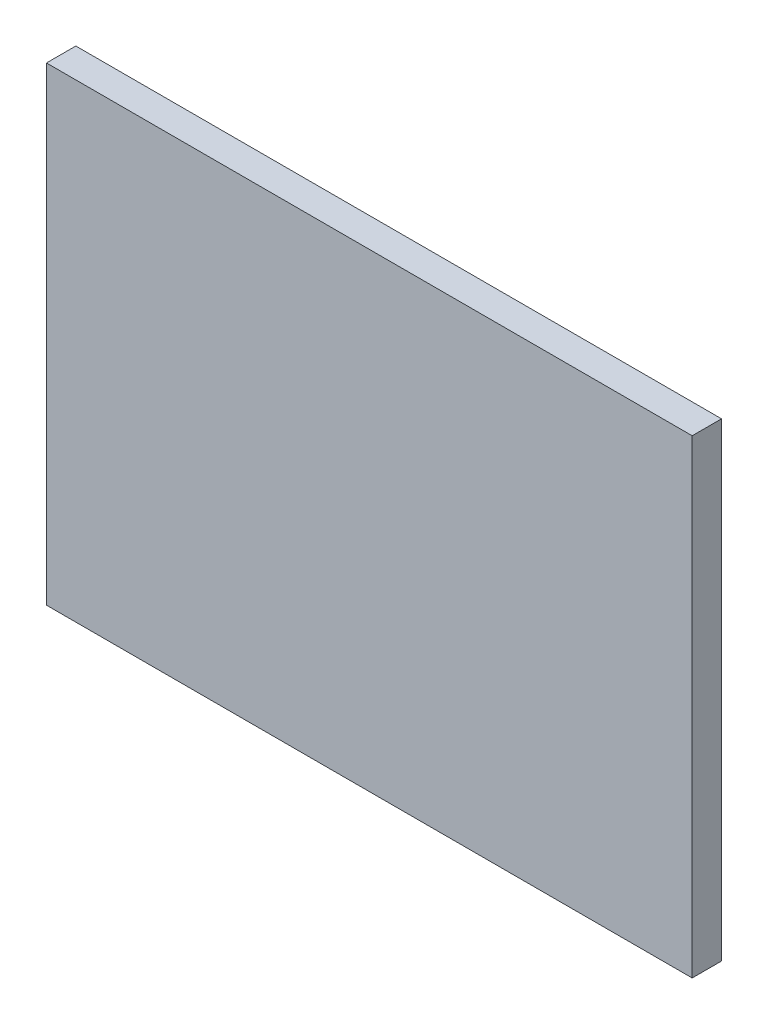
ISO-10303-21;
HEADER;
FILE_DESCRIPTION(('STEP AP214'),'2;1');
FILE_NAME('part.step','',(''),(''),'','','');
FILE_SCHEMA(('AUTOMOTIVE_DESIGN { 1 0 10303 214 1 1 1 1 }'));
ENDSEC;
DATA;
#1=APPLICATION_CONTEXT('core data for automotive mechanical design processes');
#2=APPLICATION_PROTOCOL_DEFINITION('international standard','automotive_design',2000,#1);
#3=PRODUCT_CONTEXT('',#1,'mechanical');
#4=PRODUCT('Part','Part','',(#3));
#5=PRODUCT_RELATED_PRODUCT_CATEGORY('part','',(#4));
#6=PRODUCT_DEFINITION_FORMATION('','',#4);
#7=PRODUCT_DEFINITION_CONTEXT('part definition',#1,'design');
#8=PRODUCT_DEFINITION('design','',#6,#7);
#9=PRODUCT_DEFINITION_SHAPE('','',#8);
#10=(LENGTH_UNIT() NAMED_UNIT(*) SI_UNIT(.MILLI.,.METRE.));
#11=(NAMED_UNIT(*) PLANE_ANGLE_UNIT() SI_UNIT($,.RADIAN.));
#12=(NAMED_UNIT(*) SI_UNIT($,.STERADIAN.) SOLID_ANGLE_UNIT());
#13=UNCERTAINTY_MEASURE_WITH_UNIT(LENGTH_MEASURE(1.E-05),#10,'distance_accuracy_value','');
#14=(GEOMETRIC_REPRESENTATION_CONTEXT(3) GLOBAL_UNCERTAINTY_ASSIGNED_CONTEXT((#13)) GLOBAL_UNIT_ASSIGNED_CONTEXT((#10,
#11,#12)) REPRESENTATION_CONTEXT('',''));
#15=CARTESIAN_POINT('',(0.,0.,0.));
#16=DIRECTION('',(0.,0.,1.));
#17=DIRECTION('',(1.,0.,0.));
#18=AXIS2_PLACEMENT_3D('',#15,#16,#17);
#19=CARTESIAN_POINT('',(-0.8,-0.4,0.));
#20=DIRECTION('',(0.,-1.,0.));
#21=DIRECTION('',(0.,0.,-1.));
#22=AXIS2_PLACEMENT_3D('',#19,#20,#21);
#23=PLANE('',#22);
#24=DIRECTION('',(0.,0.,-1.));
#25=VECTOR('',#24,1.);
#26=CARTESIAN_POINT('',(0.550004554478,-0.4,0.275));
#27=LINE('',#26,#25);
#28=CARTESIAN_POINT('',(0.550004554478,-0.4,0.55));
#29=VERTEX_POINT('',#28);
#30=CARTESIAN_POINT('',(0.550004554478,-0.4,0.5));
#31=VERTEX_POINT('',#30);
#32=EDGE_CURVE('E73',#29,#31,#27,.T.);
#33=ORIENTED_EDGE('',*,*,#32,.F.);
#34=DIRECTION('',(1.,0.,0.));
#35=VECTOR('',#34,1.);
#36=CARTESIAN_POINT('',(-0.8,-0.4,0.55));
#37=LINE('',#36,#35);
#38=CARTESIAN_POINT('',(-0.550004554478,-0.4,0.55));
#39=VERTEX_POINT('',#38);
#40=EDGE_CURVE('E11',#39,#29,#37,.T.);
#41=ORIENTED_EDGE('',*,*,#40,.F.);
#42=DIRECTION('',(0.,0.,1.));
#43=VECTOR('',#42,1.);
#44=CARTESIAN_POINT('',(-0.550004554478,-0.4,0.275));
#45=LINE('',#44,#43);
#46=CARTESIAN_POINT('',(-0.550004554478,-0.4,0.5));
#47=VERTEX_POINT('',#46);
#48=EDGE_CURVE('E94',#47,#39,#45,.T.);
#49=ORIENTED_EDGE('',*,*,#48,.F.);
#50=DIRECTION('',(-1.,0.,0.));
#51=VECTOR('',#50,1.);
#52=CARTESIAN_POINT('',(-0.4,-0.4,0.5));
#53=LINE('',#52,#51);
#54=EDGE_CURVE('E84',#31,#47,#53,.T.);
#55=ORIENTED_EDGE('',*,*,#54,.F.);
#56=EDGE_LOOP('',(#33,#41,#49,#55));
#57=FACE_BOUND('',#56,.T.);
#58=ADVANCED_FACE('F16',(#57),#23,.T.);
#59=CARTESIAN_POINT('',(0.,0.,0.55));
#60=DIRECTION('',(0.,0.,1.));
#61=DIRECTION('',(1.,0.,0.));
#62=AXIS2_PLACEMENT_3D('',#59,#60,#61);
#63=PLANE('',#62);
#64=DIRECTION('',(0.,-1.,0.));
#65=VECTOR('',#64,1.);
#66=CARTESIAN_POINT('',(0.550004554478,0.24884557297,0.55));
#67=LINE('',#66,#65);
#68=CARTESIAN_POINT('',(0.550004554478,0.4,0.55));
#69=VERTEX_POINT('',#68);
#70=EDGE_CURVE('E115',#69,#29,#67,.T.);
#71=ORIENTED_EDGE('',*,*,#70,.F.);
#72=DIRECTION('',(-1.,0.,0.));
#73=VECTOR('',#72,1.);
#74=CARTESIAN_POINT('',(0.8,0.4,0.55));
#75=LINE('',#74,#73);
#76=CARTESIAN_POINT('',(-0.550004554478,0.4,0.55));
#77=VERTEX_POINT('',#76);
#78=EDGE_CURVE('E26',#69,#77,#75,.T.);
#79=ORIENTED_EDGE('',*,*,#78,.T.);
#80=DIRECTION('',(0.,1.,0.));
#81=VECTOR('',#80,1.);
#82=CARTESIAN_POINT('',(-0.550004554478,-0.24884557297,0.55));
#83=LINE('',#82,#81);
#84=EDGE_CURVE('E71',#39,#77,#83,.T.);
#85=ORIENTED_EDGE('',*,*,#84,.F.);
#86=ORIENTED_EDGE('',*,*,#40,.T.);
#87=EDGE_LOOP('',(#71,#79,#85,#86));
#88=FACE_BOUND('',#87,.T.);
#89=ADVANCED_FACE('F107',(#88),#63,.T.);
#90=CARTESIAN_POINT('',(0.8,0.4,0.));
#91=DIRECTION('',(0.,1.,0.));
#92=DIRECTION('',(1.,0.,0.));
#93=AXIS2_PLACEMENT_3D('',#90,#91,#92);
#94=PLANE('',#93);
#95=DIRECTION('',(0.,0.,1.));
#96=VECTOR('',#95,1.);
#97=CARTESIAN_POINT('',(0.550004554478,0.4,0.275));
#98=LINE('',#97,#96);
#99=CARTESIAN_POINT('',(0.550004554478,0.4,0.5));
#100=VERTEX_POINT('',#99);
#101=EDGE_CURVE('E54',#100,#69,#98,.T.);
#102=ORIENTED_EDGE('',*,*,#101,.F.);
#103=DIRECTION('',(1.,0.,0.));
#104=VECTOR('',#103,1.);
#105=CARTESIAN_POINT('',(0.4,0.4,0.5));
#106=LINE('',#105,#104);
#107=CARTESIAN_POINT('',(-0.550004554478,0.4,0.5));
#108=VERTEX_POINT('',#107);
#109=EDGE_CURVE('E76',#108,#100,#106,.T.);
#110=ORIENTED_EDGE('',*,*,#109,.F.);
#111=DIRECTION('',(0.,0.,-1.));
#112=VECTOR('',#111,1.);
#113=CARTESIAN_POINT('',(-0.550004554478,0.4,0.275));
#114=LINE('',#113,#112);
#115=EDGE_CURVE('E64',#77,#108,#114,.T.);
#116=ORIENTED_EDGE('',*,*,#115,.F.);
#117=ORIENTED_EDGE('',*,*,#78,.F.);
#118=EDGE_LOOP('',(#102,#110,#116,#117));
#119=FACE_BOUND('',#118,.T.);
#120=ADVANCED_FACE('F18',(#119),#94,.T.);
#121=CARTESIAN_POINT('',(0.550004554478,0.497691145939,0.55));
#122=DIRECTION('',(1.,0.,0.));
#123=DIRECTION('',(0.,1.,0.));
#124=AXIS2_PLACEMENT_3D('',#121,#122,#123);
#125=PLANE('',#124);
#126=ORIENTED_EDGE('',*,*,#32,.T.);
#127=DIRECTION('',(0.,-1.,0.));
#128=VECTOR('',#127,1.);
#129=CARTESIAN_POINT('',(0.550004554478,-0.497691145939,0.5));
#130=LINE('',#129,#128);
#131=EDGE_CURVE('E80',#100,#31,#130,.T.);
#132=ORIENTED_EDGE('',*,*,#131,.F.);
#133=ORIENTED_EDGE('',*,*,#101,.T.);
#134=ORIENTED_EDGE('',*,*,#70,.T.);
#135=EDGE_LOOP('',(#126,#132,#133,#134));
#136=FACE_BOUND('',#135,.T.);
#137=ADVANCED_FACE('F124',(#136),#125,.T.);
#138=CARTESIAN_POINT('',(-0.550004554478,-0.497691145939,0.55));
#139=DIRECTION('',(-1.,0.,0.));
#140=DIRECTION('',(0.,0.,1.));
#141=AXIS2_PLACEMENT_3D('',#138,#139,#140);
#142=PLANE('',#141);
#143=ORIENTED_EDGE('',*,*,#48,.T.);
#144=ORIENTED_EDGE('',*,*,#84,.T.);
#145=ORIENTED_EDGE('',*,*,#115,.T.);
#146=DIRECTION('',(0.,1.,0.));
#147=VECTOR('',#146,1.);
#148=CARTESIAN_POINT('',(-0.550004554478,0.497691145939,0.5));
#149=LINE('',#148,#147);
#150=EDGE_CURVE('E68',#47,#108,#149,.T.);
#151=ORIENTED_EDGE('',*,*,#150,.F.);
#152=EDGE_LOOP('',(#143,#144,#145,#151));
#153=FACE_BOUND('',#152,.T.);
#154=ADVANCED_FACE('F66',(#153),#142,.T.);
#155=CARTESIAN_POINT('',(0.,0.,0.5));
#156=DIRECTION('',(0.,0.,-1.));
#157=DIRECTION('',(0.,-1.,0.));
#158=AXIS2_PLACEMENT_3D('',#155,#156,#157);
#159=PLANE('',#158);
#160=ORIENTED_EDGE('',*,*,#54,.T.);
#161=ORIENTED_EDGE('',*,*,#150,.T.);
#162=ORIENTED_EDGE('',*,*,#109,.T.);
#163=ORIENTED_EDGE('',*,*,#131,.T.);
#164=EDGE_LOOP('',(#160,#161,#162,#163));
#165=FACE_BOUND('',#164,.T.);
#166=ADVANCED_FACE('F82',(#165),#159,.T.);
#167=CLOSED_SHELL('',(#58,#89,#120,#137,#154,#166));
#168=MANIFOLD_SOLID_BREP('B1',#167);
#169=ADVANCED_BREP_SHAPE_REPRESENTATION('',(#18,#168),#14);
#170=SHAPE_DEFINITION_REPRESENTATION(#9,#169);
ENDSEC;
END-ISO-10303-21;
